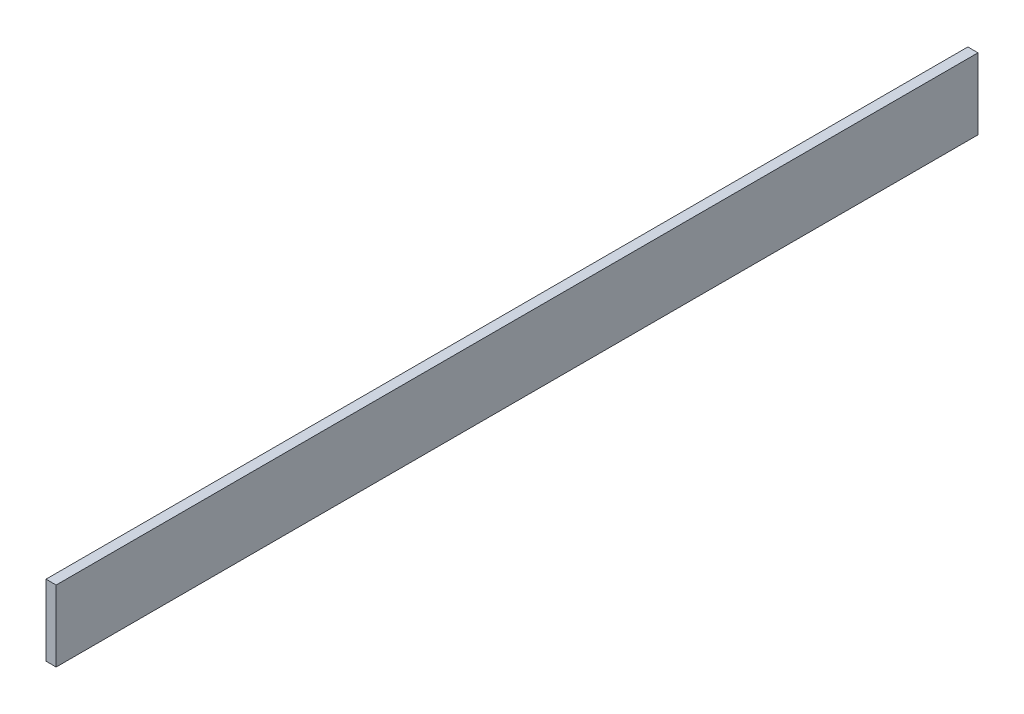
ISO-10303-21;
HEADER;
FILE_DESCRIPTION(('STEP AP214'),'2;1');
FILE_NAME('part.step','',(''),(''),'','','');
FILE_SCHEMA(('AUTOMOTIVE_DESIGN { 1 0 10303 214 1 1 1 1 }'));
ENDSEC;
DATA;
#1=APPLICATION_CONTEXT('core data for automotive mechanical design processes');
#2=APPLICATION_PROTOCOL_DEFINITION('international standard','automotive_design',2000,#1);
#3=PRODUCT_CONTEXT('',#1,'mechanical');
#4=PRODUCT('Part','Part','',(#3));
#5=PRODUCT_RELATED_PRODUCT_CATEGORY('part','',(#4));
#6=PRODUCT_DEFINITION_FORMATION('','',#4);
#7=PRODUCT_DEFINITION_CONTEXT('part definition',#1,'design');
#8=PRODUCT_DEFINITION('design','',#6,#7);
#9=PRODUCT_DEFINITION_SHAPE('','',#8);
#10=(LENGTH_UNIT() NAMED_UNIT(*) SI_UNIT(.MILLI.,.METRE.));
#11=(NAMED_UNIT(*) PLANE_ANGLE_UNIT() SI_UNIT($,.RADIAN.));
#12=(NAMED_UNIT(*) SI_UNIT($,.STERADIAN.) SOLID_ANGLE_UNIT());
#13=UNCERTAINTY_MEASURE_WITH_UNIT(LENGTH_MEASURE(1.E-05),#10,'distance_accuracy_value','');
#14=(GEOMETRIC_REPRESENTATION_CONTEXT(3) GLOBAL_UNCERTAINTY_ASSIGNED_CONTEXT((#13)) GLOBAL_UNIT_ASSIGNED_CONTEXT((#10,
#11,#12)) REPRESENTATION_CONTEXT('',''));
#15=CARTESIAN_POINT('',(0.,0.,0.));
#16=DIRECTION('',(0.,0.,1.));
#17=DIRECTION('',(1.,0.,0.));
#18=AXIS2_PLACEMENT_3D('',#15,#16,#17);
#19=CARTESIAN_POINT('',(0.,0.,288.29));
#20=DIRECTION('',(1.,0.,0.));
#21=DIRECTION('',(0.,0.,-1.));
#22=AXIS2_PLACEMENT_3D('',#19,#20,#21);
#23=PLANE('',#22);
#24=DIRECTION('',(0.,-1.,0.));
#25=VECTOR('',#24,1.);
#26=CARTESIAN_POINT('',(0.,0.,0.));
#27=LINE('',#26,#25);
#28=CARTESIAN_POINT('',(0.,22.225,0.));
#29=VERTEX_POINT('',#28);
#30=CARTESIAN_POINT('',(0.,0.,0.));
#31=VERTEX_POINT('',#30);
#32=EDGE_CURVE('E107',#29,#31,#27,.T.);
#33=ORIENTED_EDGE('',*,*,#32,.T.);
#34=DIRECTION('',(0.,0.,-1.));
#35=VECTOR('',#34,1.);
#36=CARTESIAN_POINT('',(0.,0.,288.29));
#37=LINE('',#36,#35);
#38=CARTESIAN_POINT('',(0.,0.,288.29));
#39=VERTEX_POINT('',#38);
#40=EDGE_CURVE('E11',#39,#31,#37,.T.);
#41=ORIENTED_EDGE('',*,*,#40,.F.);
#42=DIRECTION('',(0.,-1.,0.));
#43=VECTOR('',#42,1.);
#44=CARTESIAN_POINT('',(0.,0.,288.29));
#45=LINE('',#44,#43);
#46=CARTESIAN_POINT('',(0.,22.225,288.29));
#47=VERTEX_POINT('',#46);
#48=EDGE_CURVE('E91',#47,#39,#45,.T.);
#49=ORIENTED_EDGE('',*,*,#48,.F.);
#50=DIRECTION('',(0.,0.,-1.));
#51=VECTOR('',#50,1.);
#52=CARTESIAN_POINT('',(0.,22.225,288.29));
#53=LINE('',#52,#51);
#54=EDGE_CURVE('E103',#47,#29,#53,.T.);
#55=ORIENTED_EDGE('',*,*,#54,.T.);
#56=EDGE_LOOP('',(#33,#41,#49,#55));
#57=FACE_BOUND('',#56,.T.);
#58=ADVANCED_FACE('F39',(#57),#23,.F.);
#59=CARTESIAN_POINT('',(0.,0.,288.29));
#60=DIRECTION('',(0.,1.,0.));
#61=DIRECTION('',(0.,0.,1.));
#62=AXIS2_PLACEMENT_3D('',#59,#60,#61);
#63=PLANE('',#62);
#64=DIRECTION('',(1.,0.,0.));
#65=VECTOR('',#64,1.);
#66=CARTESIAN_POINT('',(0.,0.,0.));
#67=LINE('',#66,#65);
#68=CARTESIAN_POINT('',(3.175,0.,0.));
#69=VERTEX_POINT('',#68);
#70=EDGE_CURVE('E96',#31,#69,#67,.T.);
#71=ORIENTED_EDGE('',*,*,#70,.T.);
#72=DIRECTION('',(0.,0.,-1.));
#73=VECTOR('',#72,1.);
#74=CARTESIAN_POINT('',(3.175,0.,288.29));
#75=LINE('',#74,#73);
#76=CARTESIAN_POINT('',(3.175,0.,288.29));
#77=VERTEX_POINT('',#76);
#78=EDGE_CURVE('E48',#77,#69,#75,.T.);
#79=ORIENTED_EDGE('',*,*,#78,.F.);
#80=DIRECTION('',(1.,0.,0.));
#81=VECTOR('',#80,1.);
#82=CARTESIAN_POINT('',(0.,0.,288.29));
#83=LINE('',#82,#81);
#84=EDGE_CURVE('E86',#39,#77,#83,.T.);
#85=ORIENTED_EDGE('',*,*,#84,.F.);
#86=ORIENTED_EDGE('',*,*,#40,.T.);
#87=EDGE_LOOP('',(#71,#79,#85,#86));
#88=FACE_BOUND('',#87,.T.);
#89=ADVANCED_FACE('F95',(#88),#63,.F.);
#90=CARTESIAN_POINT('',(3.175,0.,288.29));
#91=DIRECTION('',(-1.,0.,0.));
#92=DIRECTION('',(0.,0.,1.));
#93=AXIS2_PLACEMENT_3D('',#90,#91,#92);
#94=PLANE('',#93);
#95=DIRECTION('',(0.,1.,0.));
#96=VECTOR('',#95,1.);
#97=CARTESIAN_POINT('',(3.175,0.,0.));
#98=LINE('',#97,#96);
#99=CARTESIAN_POINT('',(3.175,22.225,0.));
#100=VERTEX_POINT('',#99);
#101=EDGE_CURVE('E73',#69,#100,#98,.T.);
#102=ORIENTED_EDGE('',*,*,#101,.T.);
#103=DIRECTION('',(0.,0.,-1.));
#104=VECTOR('',#103,1.);
#105=CARTESIAN_POINT('',(3.175,22.225,288.29));
#106=LINE('',#105,#104);
#107=CARTESIAN_POINT('',(3.175,22.225,288.29));
#108=VERTEX_POINT('',#107);
#109=EDGE_CURVE('E98',#108,#100,#106,.T.);
#110=ORIENTED_EDGE('',*,*,#109,.F.);
#111=DIRECTION('',(0.,1.,0.));
#112=VECTOR('',#111,1.);
#113=CARTESIAN_POINT('',(3.175,0.,288.29));
#114=LINE('',#113,#112);
#115=EDGE_CURVE('E89',#77,#108,#114,.T.);
#116=ORIENTED_EDGE('',*,*,#115,.F.);
#117=ORIENTED_EDGE('',*,*,#78,.T.);
#118=EDGE_LOOP('',(#102,#110,#116,#117));
#119=FACE_BOUND('',#118,.T.);
#120=ADVANCED_FACE('F99',(#119),#94,.F.);
#121=CARTESIAN_POINT('',(0.,22.225,288.29));
#122=DIRECTION('',(0.,-1.,0.));
#123=DIRECTION('',(0.,0.,-1.));
#124=AXIS2_PLACEMENT_3D('',#121,#122,#123);
#125=PLANE('',#124);
#126=DIRECTION('',(-1.,0.,0.));
#127=VECTOR('',#126,1.);
#128=CARTESIAN_POINT('',(0.,22.225,0.));
#129=LINE('',#128,#127);
#130=EDGE_CURVE('E79',#100,#29,#129,.T.);
#131=ORIENTED_EDGE('',*,*,#130,.T.);
#132=ORIENTED_EDGE('',*,*,#54,.F.);
#133=DIRECTION('',(-1.,0.,0.));
#134=VECTOR('',#133,1.);
#135=CARTESIAN_POINT('',(0.,22.225,288.29));
#136=LINE('',#135,#134);
#137=EDGE_CURVE('E56',#108,#47,#136,.T.);
#138=ORIENTED_EDGE('',*,*,#137,.F.);
#139=ORIENTED_EDGE('',*,*,#109,.T.);
#140=EDGE_LOOP('',(#131,#132,#138,#139));
#141=FACE_BOUND('',#140,.T.);
#142=ADVANCED_FACE('F120',(#141),#125,.F.);
#143=CARTESIAN_POINT('',(0.,0.,288.29));
#144=DIRECTION('',(0.,0.,-1.));
#145=DIRECTION('',(-1.,0.,0.));
#146=AXIS2_PLACEMENT_3D('',#143,#144,#145);
#147=PLANE('',#146);
#148=ORIENTED_EDGE('',*,*,#48,.T.);
#149=ORIENTED_EDGE('',*,*,#84,.T.);
#150=ORIENTED_EDGE('',*,*,#115,.T.);
#151=ORIENTED_EDGE('',*,*,#137,.T.);
#152=EDGE_LOOP('',(#148,#149,#150,#151));
#153=FACE_BOUND('',#152,.T.);
#154=ADVANCED_FACE('F87',(#153),#147,.F.);
#155=CARTESIAN_POINT('',(0.,0.,0.));
#156=DIRECTION('',(0.,0.,-1.));
#157=DIRECTION('',(-1.,0.,0.));
#158=AXIS2_PLACEMENT_3D('',#155,#156,#157);
#159=PLANE('',#158);
#160=ORIENTED_EDGE('',*,*,#32,.F.);
#161=ORIENTED_EDGE('',*,*,#130,.F.);
#162=ORIENTED_EDGE('',*,*,#101,.F.);
#163=ORIENTED_EDGE('',*,*,#70,.F.);
#164=EDGE_LOOP('',(#160,#161,#162,#163));
#165=FACE_BOUND('',#164,.T.);
#166=ADVANCED_FACE('F123',(#165),#159,.T.);
#167=CLOSED_SHELL('',(#58,#89,#120,#142,#154,#166));
#168=MANIFOLD_SOLID_BREP('B2',#167);
#169=ADVANCED_BREP_SHAPE_REPRESENTATION('',(#18,#168),#14);
#170=SHAPE_DEFINITION_REPRESENTATION(#9,#169);
ENDSEC;
END-ISO-10303-21;
